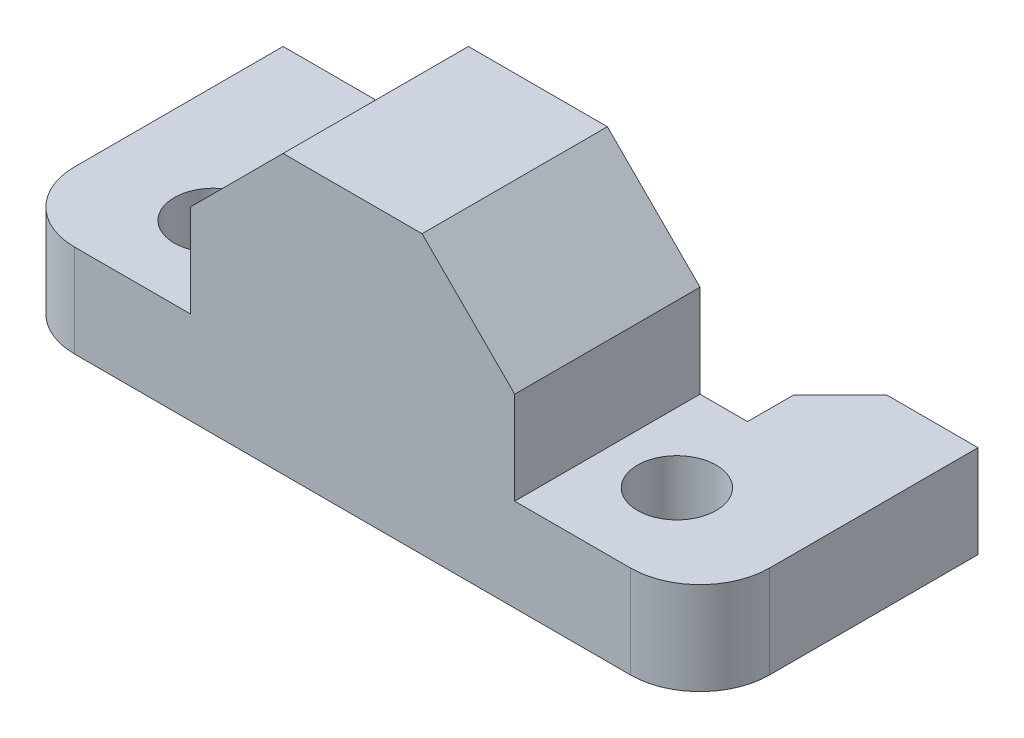
ISO-10303-21;
HEADER;
FILE_DESCRIPTION(('STEP AP214'),'2;1');
FILE_NAME('part.step','',(''),(''),'','','');
FILE_SCHEMA(('AUTOMOTIVE_DESIGN { 1 0 10303 214 1 1 1 1 }'));
ENDSEC;
DATA;
#1=APPLICATION_CONTEXT('core data for automotive mechanical design processes');
#2=APPLICATION_PROTOCOL_DEFINITION('international standard','automotive_design',2000,#1);
#3=PRODUCT_CONTEXT('',#1,'mechanical');
#4=PRODUCT('Part','Part','',(#3));
#5=PRODUCT_RELATED_PRODUCT_CATEGORY('part','',(#4));
#6=PRODUCT_DEFINITION_FORMATION('','',#4);
#7=PRODUCT_DEFINITION_CONTEXT('part definition',#1,'design');
#8=PRODUCT_DEFINITION('design','',#6,#7);
#9=PRODUCT_DEFINITION_SHAPE('','',#8);
#10=(LENGTH_UNIT() NAMED_UNIT(*) SI_UNIT(.MILLI.,.METRE.));
#11=(NAMED_UNIT(*) PLANE_ANGLE_UNIT() SI_UNIT($,.RADIAN.));
#12=(NAMED_UNIT(*) SI_UNIT($,.STERADIAN.) SOLID_ANGLE_UNIT());
#13=UNCERTAINTY_MEASURE_WITH_UNIT(LENGTH_MEASURE(1.E-05),#10,'distance_accuracy_value','');
#14=(GEOMETRIC_REPRESENTATION_CONTEXT(3) GLOBAL_UNCERTAINTY_ASSIGNED_CONTEXT((#13)) GLOBAL_UNIT_ASSIGNED_CONTEXT((#10,
#11,#12)) REPRESENTATION_CONTEXT('',''));
#15=CARTESIAN_POINT('',(0.,0.,0.));
#16=DIRECTION('',(0.,0.,1.));
#17=DIRECTION('',(1.,0.,0.));
#18=AXIS2_PLACEMENT_3D('',#15,#16,#17);
#19=CARTESIAN_POINT('',(0.,4.,0.));
#20=DIRECTION('',(0.,-1.,0.));
#21=DIRECTION('',(0.,0.,-1.));
#22=AXIS2_PLACEMENT_3D('',#19,#20,#21);
#23=PLANE('',#22);
#24=CARTESIAN_POINT('',(0.,4.,0.));
#25=DIRECTION('',(0.,1.,0.));
#26=DIRECTION('',(0.,0.,1.));
#27=AXIS2_PLACEMENT_3D('',#24,#25,#26);
#28=CIRCLE('',#27,1.7);
#29=CARTESIAN_POINT('',(0.,4.,1.7));
#30=VERTEX_POINT('',#29);
#31=EDGE_CURVE('E271',#30,#30,#28,.T.);
#32=ORIENTED_EDGE('',*,*,#31,.F.);
#33=EDGE_LOOP('',(#32));
#34=FACE_BOUND('',#33,.T.);
#35=DIRECTION('',(0.,0.,1.));
#36=VECTOR('',#35,1.);
#37=CARTESIAN_POINT('',(0.949999999999993,4.,0.));
#38=LINE('',#37,#36);
#39=CARTESIAN_POINT('',(0.949999999999993,4.,-6.00000000000001));
#40=VERTEX_POINT('',#39);
#41=CARTESIAN_POINT('',(0.949999999999993,4.,-4.));
#42=VERTEX_POINT('',#41);
#43=EDGE_CURVE('E239',#40,#42,#38,.T.);
#44=ORIENTED_EDGE('',*,*,#43,.F.);
#45=DIRECTION('',(0.707106781186549,0.,0.707106781186546));
#46=VECTOR('',#45,1.);
#47=CARTESIAN_POINT('',(0.949999999999993,4.,-6.00000000000001));
#48=LINE('',#47,#46);
#49=CARTESIAN_POINT('',(-1.05000000000001,4.,-8.));
#50=VERTEX_POINT('',#49);
#51=EDGE_CURVE('E59',#40,#50,#48,.F.);
#52=ORIENTED_EDGE('',*,*,#51,.T.);
#53=DIRECTION('',(1.,0.,0.));
#54=VECTOR('',#53,1.);
#55=CARTESIAN_POINT('',(0.,4.,-8.));
#56=LINE('',#55,#54);
#57=CARTESIAN_POINT('',(-5.,4.,-8.));
#58=VERTEX_POINT('',#57);
#59=EDGE_CURVE('E246',#58,#50,#56,.T.);
#60=ORIENTED_EDGE('',*,*,#59,.F.);
#61=DIRECTION('',(0.,0.,1.));
#62=VECTOR('',#61,1.);
#63=CARTESIAN_POINT('',(-5.,4.,4.));
#64=LINE('',#63,#62);
#65=CARTESIAN_POINT('',(-5.,4.,1.));
#66=VERTEX_POINT('',#65);
#67=EDGE_CURVE('E199',#58,#66,#64,.T.);
#68=ORIENTED_EDGE('',*,*,#67,.T.);
#69=CARTESIAN_POINT('',(-2.,4.,1.));
#70=DIRECTION('',(0.,-1.,0.));
#71=DIRECTION('',(0.,0.,-1.));
#72=AXIS2_PLACEMENT_3D('',#69,#70,#71);
#73=CIRCLE('',#72,3.);
#74=CARTESIAN_POINT('',(-2.,4.,4.));
#75=VERTEX_POINT('',#74);
#76=EDGE_CURVE('E322',#66,#75,#73,.F.);
#77=ORIENTED_EDGE('',*,*,#76,.T.);
#78=DIRECTION('',(1.,0.,0.));
#79=VECTOR('',#78,1.);
#80=CARTESIAN_POINT('',(-5.,4.,4.));
#81=LINE('',#80,#79);
#82=CARTESIAN_POINT('',(2.99999999999999,4.,4.));
#83=VERTEX_POINT('',#82);
#84=EDGE_CURVE('E287',#75,#83,#81,.T.);
#85=ORIENTED_EDGE('',*,*,#84,.T.);
#86=DIRECTION('',(0.,0.,1.));
#87=VECTOR('',#86,1.);
#88=CARTESIAN_POINT('',(2.99999999999999,4.,-4.));
#89=LINE('',#88,#87);
#90=CARTESIAN_POINT('',(2.99999999999999,4.,-4.));
#91=VERTEX_POINT('',#90);
#92=EDGE_CURVE('E205',#91,#83,#89,.T.);
#93=ORIENTED_EDGE('',*,*,#92,.F.);
#94=DIRECTION('',(-1.,0.,0.));
#95=VECTOR('',#94,1.);
#96=CARTESIAN_POINT('',(-5.,4.,-4.));
#97=LINE('',#96,#95);
#98=EDGE_CURVE('E200',#91,#42,#97,.T.);
#99=ORIENTED_EDGE('',*,*,#98,.T.);
#100=EDGE_LOOP('',(#44,#52,#60,#68,#77,#85,#93,#99));
#101=FACE_BOUND('',#100,.T.);
#102=ADVANCED_FACE('F49',(#34,#101),#23,.F.);
#103=CARTESIAN_POINT('',(20.,4.,0.));
#104=DIRECTION('',(0.,1.,0.));
#105=DIRECTION('',(0.,0.,1.));
#106=AXIS2_PLACEMENT_3D('',#103,#104,#105);
#107=CIRCLE('',#106,1.7);
#108=CARTESIAN_POINT('',(20.,4.,1.7));
#109=VERTEX_POINT('',#108);
#110=EDGE_CURVE('E263',#109,#109,#107,.T.);
#111=ORIENTED_EDGE('',*,*,#110,.F.);
#112=EDGE_LOOP('',(#111));
#113=FACE_BOUND('',#112,.T.);
#114=DIRECTION('',(-1.,0.,0.));
#115=VECTOR('',#114,1.);
#116=CARTESIAN_POINT('',(0.,4.,-8.00000000000001));
#117=LINE('',#116,#115);
#118=CARTESIAN_POINT('',(25.,4.,-8.));
#119=VERTEX_POINT('',#118);
#120=CARTESIAN_POINT('',(21.05,4.,-8.));
#121=VERTEX_POINT('',#120);
#122=EDGE_CURVE('E222',#119,#121,#117,.T.);
#123=ORIENTED_EDGE('',*,*,#122,.T.);
#124=DIRECTION('',(0.707106781186547,0.,-0.707106781186548));
#125=VECTOR('',#124,1.);
#126=CARTESIAN_POINT('',(21.05,4.,-8.));
#127=LINE('',#126,#125);
#128=CARTESIAN_POINT('',(19.05,4.,-6.));
#129=VERTEX_POINT('',#128);
#130=EDGE_CURVE('E360',#121,#129,#127,.F.);
#131=ORIENTED_EDGE('',*,*,#130,.T.);
#132=DIRECTION('',(0.,0.,1.));
#133=VECTOR('',#132,1.);
#134=CARTESIAN_POINT('',(19.05,4.,0.));
#135=LINE('',#134,#133);
#136=CARTESIAN_POINT('',(19.05,4.,-4.));
#137=VERTEX_POINT('',#136);
#138=EDGE_CURVE('E196',#129,#137,#135,.T.);
#139=ORIENTED_EDGE('',*,*,#138,.T.);
#140=CARTESIAN_POINT('',(17.,4.,-4.));
#141=VERTEX_POINT('',#140);
#142=EDGE_CURVE('E180',#137,#141,#97,.T.);
#143=ORIENTED_EDGE('',*,*,#142,.T.);
#144=DIRECTION('',(0.,0.,-1.));
#145=VECTOR('',#144,1.);
#146=CARTESIAN_POINT('',(17.,4.,-4.));
#147=LINE('',#146,#145);
#148=CARTESIAN_POINT('',(17.,4.,4.));
#149=VERTEX_POINT('',#148);
#150=EDGE_CURVE('E193',#149,#141,#147,.T.);
#151=ORIENTED_EDGE('',*,*,#150,.F.);
#152=CARTESIAN_POINT('',(22.,4.,4.));
#153=VERTEX_POINT('',#152);
#154=EDGE_CURVE('E286',#149,#153,#81,.T.);
#155=ORIENTED_EDGE('',*,*,#154,.T.);
#156=CARTESIAN_POINT('',(22.,4.,0.999999999999999));
#157=DIRECTION('',(0.,-1.,0.));
#158=DIRECTION('',(0.,0.,-1.));
#159=AXIS2_PLACEMENT_3D('',#156,#157,#158);
#160=CIRCLE('',#159,3.);
#161=CARTESIAN_POINT('',(25.,4.,0.999999999999999));
#162=VERTEX_POINT('',#161);
#163=EDGE_CURVE('E325',#153,#162,#160,.F.);
#164=ORIENTED_EDGE('',*,*,#163,.T.);
#165=DIRECTION('',(0.,0.,-1.));
#166=VECTOR('',#165,1.);
#167=CARTESIAN_POINT('',(25.,4.,4.));
#168=LINE('',#167,#166);
#169=EDGE_CURVE('E279',#162,#119,#168,.T.);
#170=ORIENTED_EDGE('',*,*,#169,.T.);
#171=EDGE_LOOP('',(#123,#131,#139,#143,#151,#155,#164,#170));
#172=FACE_BOUND('',#171,.T.);
#173=ADVANCED_FACE('F192',(#113,#172),#23,.F.);
#174=CARTESIAN_POINT('',(0.,0.,0.));
#175=DIRECTION('',(0.,-1.,0.));
#176=DIRECTION('',(0.,0.,-1.));
#177=AXIS2_PLACEMENT_3D('',#174,#175,#176);
#178=PLANE('',#177);
#179=CARTESIAN_POINT('',(0.,0.,0.));
#180=DIRECTION('',(0.,1.,0.));
#181=DIRECTION('',(0.,0.,1.));
#182=AXIS2_PLACEMENT_3D('',#179,#180,#181);
#183=CIRCLE('',#182,1.7);
#184=CARTESIAN_POINT('',(0.,0.,1.7));
#185=VERTEX_POINT('',#184);
#186=EDGE_CURVE('E267',#185,#185,#183,.T.);
#187=ORIENTED_EDGE('',*,*,#186,.T.);
#188=EDGE_LOOP('',(#187));
#189=FACE_BOUND('',#188,.T.);
#190=DIRECTION('',(0.,0.,1.));
#191=VECTOR('',#190,1.);
#192=CARTESIAN_POINT('',(19.05,0.,0.));
#193=LINE('',#192,#191);
#194=CARTESIAN_POINT('',(19.05,0.,-6.));
#195=VERTEX_POINT('',#194);
#196=CARTESIAN_POINT('',(19.05,0.,-4.));
#197=VERTEX_POINT('',#196);
#198=EDGE_CURVE('E227',#195,#197,#193,.T.);
#199=ORIENTED_EDGE('',*,*,#198,.F.);
#200=DIRECTION('',(-0.707106781186547,0.,0.707106781186548));
#201=VECTOR('',#200,1.);
#202=CARTESIAN_POINT('',(6.52500000000002,0.,6.525));
#203=LINE('',#202,#201);
#204=CARTESIAN_POINT('',(21.05,0.,-8.));
#205=VERTEX_POINT('',#204);
#206=EDGE_CURVE('E369',#195,#205,#203,.F.);
#207=ORIENTED_EDGE('',*,*,#206,.T.);
#208=DIRECTION('',(-1.,0.,0.));
#209=VECTOR('',#208,1.);
#210=CARTESIAN_POINT('',(0.,0.,-8.00000000000001));
#211=LINE('',#210,#209);
#212=CARTESIAN_POINT('',(25.,0.,-8.));
#213=VERTEX_POINT('',#212);
#214=EDGE_CURVE('E223',#213,#205,#211,.T.);
#215=ORIENTED_EDGE('',*,*,#214,.F.);
#216=DIRECTION('',(0.,0.,-1.));
#217=VECTOR('',#216,1.);
#218=CARTESIAN_POINT('',(25.,0.,4.));
#219=LINE('',#218,#217);
#220=CARTESIAN_POINT('',(25.,0.,0.999999999999999));
#221=VERTEX_POINT('',#220);
#222=EDGE_CURVE('E275',#221,#213,#219,.T.);
#223=ORIENTED_EDGE('',*,*,#222,.F.);
#224=CARTESIAN_POINT('',(22.,0.,0.999999999999999));
#225=DIRECTION('',(0.,-1.,0.));
#226=DIRECTION('',(0.,0.,-1.));
#227=AXIS2_PLACEMENT_3D('',#224,#225,#226);
#228=CIRCLE('',#227,3.);
#229=CARTESIAN_POINT('',(22.,0.,4.));
#230=VERTEX_POINT('',#229);
#231=EDGE_CURVE('E311',#221,#230,#228,.T.);
#232=ORIENTED_EDGE('',*,*,#231,.T.);
#233=DIRECTION('',(1.,0.,0.));
#234=VECTOR('',#233,1.);
#235=CARTESIAN_POINT('',(-5.,0.,4.));
#236=LINE('',#235,#234);
#237=CARTESIAN_POINT('',(-2.,0.,4.));
#238=VERTEX_POINT('',#237);
#239=EDGE_CURVE('E281',#238,#230,#236,.T.);
#240=ORIENTED_EDGE('',*,*,#239,.F.);
#241=CARTESIAN_POINT('',(-2.,0.,1.));
#242=DIRECTION('',(0.,-1.,0.));
#243=DIRECTION('',(0.,0.,-1.));
#244=AXIS2_PLACEMENT_3D('',#241,#242,#243);
#245=CIRCLE('',#244,3.);
#246=CARTESIAN_POINT('',(-5.,0.,1.));
#247=VERTEX_POINT('',#246);
#248=EDGE_CURVE('E308',#238,#247,#245,.T.);
#249=ORIENTED_EDGE('',*,*,#248,.T.);
#250=DIRECTION('',(0.,0.,1.));
#251=VECTOR('',#250,1.);
#252=CARTESIAN_POINT('',(-5.,0.,4.));
#253=LINE('',#252,#251);
#254=CARTESIAN_POINT('',(-5.,0.,-8.));
#255=VERTEX_POINT('',#254);
#256=EDGE_CURVE('E298',#255,#247,#253,.T.);
#257=ORIENTED_EDGE('',*,*,#256,.F.);
#258=DIRECTION('',(1.,0.,0.));
#259=VECTOR('',#258,1.);
#260=CARTESIAN_POINT('',(0.,0.,-8.));
#261=LINE('',#260,#259);
#262=CARTESIAN_POINT('',(-1.05000000000001,0.,-8.));
#263=VERTEX_POINT('',#262);
#264=EDGE_CURVE('E245',#255,#263,#261,.T.);
#265=ORIENTED_EDGE('',*,*,#264,.T.);
#266=DIRECTION('',(-0.707106781186549,0.,-0.707106781186546));
#267=VECTOR('',#266,1.);
#268=CARTESIAN_POINT('',(3.475,0.,-3.47500000000001));
#269=LINE('',#268,#267);
#270=CARTESIAN_POINT('',(0.949999999999993,0.,-6.00000000000001));
#271=VERTEX_POINT('',#270);
#272=EDGE_CURVE('E366',#263,#271,#269,.F.);
#273=ORIENTED_EDGE('',*,*,#272,.T.);
#274=DIRECTION('',(0.,0.,1.));
#275=VECTOR('',#274,1.);
#276=CARTESIAN_POINT('',(0.949999999999993,0.,0.));
#277=LINE('',#276,#275);
#278=CARTESIAN_POINT('',(0.949999999999993,0.,-4.));
#279=VERTEX_POINT('',#278);
#280=EDGE_CURVE('E242',#271,#279,#277,.T.);
#281=ORIENTED_EDGE('',*,*,#280,.T.);
#282=DIRECTION('',(-1.,0.,0.));
#283=VECTOR('',#282,1.);
#284=CARTESIAN_POINT('',(-5.,0.,-4.));
#285=LINE('',#284,#283);
#286=EDGE_CURVE('E294',#197,#279,#285,.T.);
#287=ORIENTED_EDGE('',*,*,#286,.F.);
#288=EDGE_LOOP('',(#199,#207,#215,#223,#232,#240,#249,#257,#265,#273,#281,#287));
#289=FACE_BOUND('',#288,.T.);
#290=CARTESIAN_POINT('',(20.,0.,0.));
#291=DIRECTION('',(0.,1.,0.));
#292=DIRECTION('',(0.,0.,1.));
#293=AXIS2_PLACEMENT_3D('',#290,#291,#292);
#294=CIRCLE('',#293,1.7);
#295=CARTESIAN_POINT('',(20.,0.,1.7));
#296=VERTEX_POINT('',#295);
#297=EDGE_CURVE('E259',#296,#296,#294,.T.);
#298=ORIENTED_EDGE('',*,*,#297,.T.);
#299=EDGE_LOOP('',(#298));
#300=FACE_BOUND('',#299,.T.);
#301=ADVANCED_FACE('F406',(#189,#289,#300),#178,.T.);
#302=CARTESIAN_POINT('',(25.,4.,4.));
#303=DIRECTION('',(-1.,0.,0.));
#304=DIRECTION('',(0.,0.,1.));
#305=AXIS2_PLACEMENT_3D('',#302,#303,#304);
#306=PLANE('',#305);
#307=ORIENTED_EDGE('',*,*,#169,.F.);
#308=DIRECTION('',(0.,-1.,0.));
#309=VECTOR('',#308,1.);
#310=CARTESIAN_POINT('',(25.,4.,0.999999999999999));
#311=LINE('',#310,#309);
#312=EDGE_CURVE('E291',#162,#221,#311,.T.);
#313=ORIENTED_EDGE('',*,*,#312,.T.);
#314=ORIENTED_EDGE('',*,*,#222,.T.);
#315=DIRECTION('',(0.,1.,0.));
#316=VECTOR('',#315,1.);
#317=CARTESIAN_POINT('',(25.,0.,-8.));
#318=LINE('',#317,#316);
#319=EDGE_CURVE('E235',#213,#119,#318,.T.);
#320=ORIENTED_EDGE('',*,*,#319,.T.);
#321=EDGE_LOOP('',(#307,#313,#314,#320));
#322=FACE_BOUND('',#321,.T.);
#323=ADVANCED_FACE('F398',(#322),#306,.F.);
#324=CARTESIAN_POINT('',(-5.,4.,-4.));
#325=DIRECTION('',(0.,0.,1.));
#326=DIRECTION('',(1.,0.,0.));
#327=AXIS2_PLACEMENT_3D('',#324,#325,#326);
#328=PLANE('',#327);
#329=DIRECTION('',(-1.,0.,0.));
#330=VECTOR('',#329,1.);
#331=CARTESIAN_POINT('',(17.,12.,-4.));
#332=LINE('',#331,#330);
#333=CARTESIAN_POINT('',(13.,12.,-4.));
#334=VERTEX_POINT('',#333);
#335=CARTESIAN_POINT('',(6.99999999999999,12.,-4.));
#336=VERTEX_POINT('',#335);
#337=EDGE_CURVE('E212',#334,#336,#332,.T.);
#338=ORIENTED_EDGE('',*,*,#337,.F.);
#339=DIRECTION('',(-0.707106781186546,0.707106781186549,0.));
#340=VECTOR('',#339,1.);
#341=CARTESIAN_POINT('',(13.,12.,-4.));
#342=LINE('',#341,#340);
#343=CARTESIAN_POINT('',(17.,7.99999999999999,-4.));
#344=VERTEX_POINT('',#343);
#345=EDGE_CURVE('E181',#334,#344,#342,.F.);
#346=ORIENTED_EDGE('',*,*,#345,.T.);
#347=DIRECTION('',(0.,-1.,0.));
#348=VECTOR('',#347,1.);
#349=CARTESIAN_POINT('',(17.,12.,-4.));
#350=LINE('',#349,#348);
#351=EDGE_CURVE('E175',#344,#141,#350,.T.);
#352=ORIENTED_EDGE('',*,*,#351,.T.);
#353=ORIENTED_EDGE('',*,*,#142,.F.);
#354=DIRECTION('',(0.,1.,0.));
#355=VECTOR('',#354,1.);
#356=CARTESIAN_POINT('',(19.05,0.,-4.));
#357=LINE('',#356,#355);
#358=EDGE_CURVE('E230',#197,#137,#357,.T.);
#359=ORIENTED_EDGE('',*,*,#358,.F.);
#360=ORIENTED_EDGE('',*,*,#286,.T.);
#361=DIRECTION('',(0.,1.,0.));
#362=VECTOR('',#361,1.);
#363=CARTESIAN_POINT('',(0.949999999999993,0.,-4.));
#364=LINE('',#363,#362);
#365=EDGE_CURVE('E250',#279,#42,#364,.T.);
#366=ORIENTED_EDGE('',*,*,#365,.T.);
#367=ORIENTED_EDGE('',*,*,#98,.F.);
#368=DIRECTION('',(0.,-1.,0.));
#369=VECTOR('',#368,1.);
#370=CARTESIAN_POINT('',(2.99999999999999,12.,-4.));
#371=LINE('',#370,#369);
#372=CARTESIAN_POINT('',(2.99999999999999,7.99999999999999,-4.));
#373=VERTEX_POINT('',#372);
#374=EDGE_CURVE('E187',#373,#91,#371,.T.);
#375=ORIENTED_EDGE('',*,*,#374,.F.);
#376=DIRECTION('',(-0.707106781186546,-0.707106781186549,0.));
#377=VECTOR('',#376,1.);
#378=CARTESIAN_POINT('',(6.99999999999999,12.,-4.));
#379=LINE('',#378,#377);
#380=EDGE_CURVE('E339',#373,#336,#379,.F.);
#381=ORIENTED_EDGE('',*,*,#380,.T.);
#382=EDGE_LOOP('',(#338,#346,#352,#353,#359,#360,#366,#367,#375,#381));
#383=FACE_BOUND('',#382,.T.);
#384=ADVANCED_FACE('F178',(#383),#328,.F.);
#385=CARTESIAN_POINT('',(-5.,4.,4.));
#386=DIRECTION('',(1.,0.,0.));
#387=DIRECTION('',(0.,0.,-1.));
#388=AXIS2_PLACEMENT_3D('',#385,#386,#387);
#389=PLANE('',#388);
#390=ORIENTED_EDGE('',*,*,#256,.T.);
#391=DIRECTION('',(0.,-1.,0.));
#392=VECTOR('',#391,1.);
#393=CARTESIAN_POINT('',(-5.,4.,1.));
#394=LINE('',#393,#392);
#395=EDGE_CURVE('E328',#247,#66,#394,.F.);
#396=ORIENTED_EDGE('',*,*,#395,.T.);
#397=ORIENTED_EDGE('',*,*,#67,.F.);
#398=DIRECTION('',(0.,1.,0.));
#399=VECTOR('',#398,1.);
#400=CARTESIAN_POINT('',(-5.,0.,-8.));
#401=LINE('',#400,#399);
#402=EDGE_CURVE('E255',#255,#58,#401,.T.);
#403=ORIENTED_EDGE('',*,*,#402,.F.);
#404=EDGE_LOOP('',(#390,#396,#397,#403));
#405=FACE_BOUND('',#404,.T.);
#406=ADVANCED_FACE('F418',(#405),#389,.F.);
#407=CARTESIAN_POINT('',(-5.,4.,4.));
#408=DIRECTION('',(0.,0.,-1.));
#409=DIRECTION('',(-1.,0.,0.));
#410=AXIS2_PLACEMENT_3D('',#407,#408,#409);
#411=PLANE('',#410);
#412=DIRECTION('',(0.,-1.,0.));
#413=VECTOR('',#412,1.);
#414=CARTESIAN_POINT('',(17.,12.,4.));
#415=LINE('',#414,#413);
#416=CARTESIAN_POINT('',(17.,7.99999999999999,4.));
#417=VERTEX_POINT('',#416);
#418=EDGE_CURVE('E186',#417,#149,#415,.T.);
#419=ORIENTED_EDGE('',*,*,#418,.F.);
#420=DIRECTION('',(0.707106781186546,-0.707106781186549,0.));
#421=VECTOR('',#420,1.);
#422=CARTESIAN_POINT('',(13.,12.,4.));
#423=LINE('',#422,#421);
#424=CARTESIAN_POINT('',(13.,12.,4.));
#425=VERTEX_POINT('',#424);
#426=EDGE_CURVE('E350',#417,#425,#423,.F.);
#427=ORIENTED_EDGE('',*,*,#426,.T.);
#428=DIRECTION('',(1.,0.,0.));
#429=VECTOR('',#428,1.);
#430=CARTESIAN_POINT('',(2.99999999999999,12.,4.));
#431=LINE('',#430,#429);
#432=CARTESIAN_POINT('',(6.99999999999999,12.,4.));
#433=VERTEX_POINT('',#432);
#434=EDGE_CURVE('E209',#433,#425,#431,.T.);
#435=ORIENTED_EDGE('',*,*,#434,.F.);
#436=DIRECTION('',(0.707106781186546,0.707106781186549,0.));
#437=VECTOR('',#436,1.);
#438=CARTESIAN_POINT('',(6.99999999999999,12.,4.));
#439=LINE('',#438,#437);
#440=CARTESIAN_POINT('',(2.99999999999999,7.99999999999999,4.));
#441=VERTEX_POINT('',#440);
#442=EDGE_CURVE('E347',#433,#441,#439,.F.);
#443=ORIENTED_EDGE('',*,*,#442,.T.);
#444=DIRECTION('',(0.,-1.,0.));
#445=VECTOR('',#444,1.);
#446=CARTESIAN_POINT('',(2.99999999999999,12.,4.));
#447=LINE('',#446,#445);
#448=EDGE_CURVE('E215',#441,#83,#447,.T.);
#449=ORIENTED_EDGE('',*,*,#448,.T.);
#450=ORIENTED_EDGE('',*,*,#84,.F.);
#451=DIRECTION('',(0.,-1.,0.));
#452=VECTOR('',#451,1.);
#453=CARTESIAN_POINT('',(-2.,4.,4.));
#454=LINE('',#453,#452);
#455=EDGE_CURVE('E314',#75,#238,#454,.T.);
#456=ORIENTED_EDGE('',*,*,#455,.T.);
#457=ORIENTED_EDGE('',*,*,#239,.T.);
#458=DIRECTION('',(0.,-1.,0.));
#459=VECTOR('',#458,1.);
#460=CARTESIAN_POINT('',(22.,4.,4.));
#461=LINE('',#460,#459);
#462=EDGE_CURVE('E318',#230,#153,#461,.F.);
#463=ORIENTED_EDGE('',*,*,#462,.T.);
#464=ORIENTED_EDGE('',*,*,#154,.F.);
#465=EDGE_LOOP('',(#419,#427,#435,#443,#449,#450,#456,#457,#463,#464));
#466=FACE_BOUND('',#465,.T.);
#467=ADVANCED_FACE('F391',(#466),#411,.F.);
#468=CARTESIAN_POINT('',(0.,4.,0.));
#469=DIRECTION('',(0.,-1.,0.));
#470=DIRECTION('',(0.,0.,-1.));
#471=AXIS2_PLACEMENT_3D('',#468,#469,#470);
#472=CYLINDRICAL_SURFACE('',#471,1.7);
#473=ORIENTED_EDGE('',*,*,#31,.T.);
#474=EDGE_LOOP('',(#473));
#475=FACE_BOUND('',#474,.T.);
#476=ORIENTED_EDGE('',*,*,#186,.F.);
#477=EDGE_LOOP('',(#476));
#478=FACE_BOUND('',#477,.T.);
#479=ADVANCED_FACE('F458',(#475,#478),#472,.F.);
#480=CARTESIAN_POINT('',(20.,4.,0.));
#481=DIRECTION('',(0.,-1.,0.));
#482=DIRECTION('',(0.,0.,-1.));
#483=AXIS2_PLACEMENT_3D('',#480,#481,#482);
#484=CYLINDRICAL_SURFACE('',#483,1.7);
#485=ORIENTED_EDGE('',*,*,#110,.T.);
#486=EDGE_LOOP('',(#485));
#487=FACE_BOUND('',#486,.T.);
#488=ORIENTED_EDGE('',*,*,#297,.F.);
#489=EDGE_LOOP('',(#488));
#490=FACE_BOUND('',#489,.T.);
#491=ADVANCED_FACE('F473',(#487,#490),#484,.F.);
#492=CARTESIAN_POINT('',(22.,4.,0.999999999999999));
#493=DIRECTION('',(0.,-1.,0.));
#494=DIRECTION('',(0.,0.,-1.));
#495=AXIS2_PLACEMENT_3D('',#492,#493,#494);
#496=CYLINDRICAL_SURFACE('',#495,3.);
#497=ORIENTED_EDGE('',*,*,#163,.F.);
#498=ORIENTED_EDGE('',*,*,#462,.F.);
#499=ORIENTED_EDGE('',*,*,#231,.F.);
#500=ORIENTED_EDGE('',*,*,#312,.F.);
#501=EDGE_LOOP('',(#497,#498,#499,#500));
#502=FACE_BOUND('',#501,.T.);
#503=ADVANCED_FACE('F402',(#502),#496,.T.);
#504=CARTESIAN_POINT('',(-2.,4.,1.));
#505=DIRECTION('',(0.,-1.,0.));
#506=DIRECTION('',(0.,0.,-1.));
#507=AXIS2_PLACEMENT_3D('',#504,#505,#506);
#508=CYLINDRICAL_SURFACE('',#507,3.);
#509=ORIENTED_EDGE('',*,*,#76,.F.);
#510=ORIENTED_EDGE('',*,*,#395,.F.);
#511=ORIENTED_EDGE('',*,*,#248,.F.);
#512=ORIENTED_EDGE('',*,*,#455,.F.);
#513=EDGE_LOOP('',(#509,#510,#511,#512));
#514=FACE_BOUND('',#513,.T.);
#515=ADVANCED_FACE('F413',(#514),#508,.T.);
#516=CARTESIAN_POINT('',(0.,0.,-8.));
#517=DIRECTION('',(0.,0.,1.));
#518=DIRECTION('',(1.,0.,0.));
#519=AXIS2_PLACEMENT_3D('',#516,#517,#518);
#520=PLANE('',#519);
#521=ORIENTED_EDGE('',*,*,#59,.T.);
#522=DIRECTION('',(0.,-1.,0.));
#523=VECTOR('',#522,1.);
#524=CARTESIAN_POINT('',(-1.05000000000001,0.,-8.));
#525=LINE('',#524,#523);
#526=EDGE_CURVE('E11',#50,#263,#525,.T.);
#527=ORIENTED_EDGE('',*,*,#526,.T.);
#528=ORIENTED_EDGE('',*,*,#264,.F.);
#529=ORIENTED_EDGE('',*,*,#402,.T.);
#530=EDGE_LOOP('',(#521,#527,#528,#529));
#531=FACE_BOUND('',#530,.T.);
#532=ADVANCED_FACE('F420',(#531),#520,.F.);
#533=CARTESIAN_POINT('',(0.949999999999993,0.,0.));
#534=DIRECTION('',(-1.,0.,0.));
#535=DIRECTION('',(0.,0.,1.));
#536=AXIS2_PLACEMENT_3D('',#533,#534,#535);
#537=PLANE('',#536);
#538=ORIENTED_EDGE('',*,*,#280,.F.);
#539=DIRECTION('',(0.,1.,0.));
#540=VECTOR('',#539,1.);
#541=CARTESIAN_POINT('',(0.949999999999993,0.,-6.00000000000001));
#542=LINE('',#541,#540);
#543=EDGE_CURVE('E372',#271,#40,#542,.T.);
#544=ORIENTED_EDGE('',*,*,#543,.T.);
#545=ORIENTED_EDGE('',*,*,#43,.T.);
#546=ORIENTED_EDGE('',*,*,#365,.F.);
#547=EDGE_LOOP('',(#538,#544,#545,#546));
#548=FACE_BOUND('',#547,.T.);
#549=ADVANCED_FACE('F424',(#548),#537,.F.);
#550=CARTESIAN_POINT('',(0.,0.,-8.00000000000001));
#551=DIRECTION('',(0.,0.,-1.));
#552=DIRECTION('',(-1.,0.,0.));
#553=AXIS2_PLACEMENT_3D('',#550,#551,#552);
#554=PLANE('',#553);
#555=ORIENTED_EDGE('',*,*,#214,.T.);
#556=DIRECTION('',(0.,1.,0.));
#557=VECTOR('',#556,1.);
#558=CARTESIAN_POINT('',(21.05,0.,-8.));
#559=LINE('',#558,#557);
#560=EDGE_CURVE('E356',#205,#121,#559,.T.);
#561=ORIENTED_EDGE('',*,*,#560,.T.);
#562=ORIENTED_EDGE('',*,*,#122,.F.);
#563=ORIENTED_EDGE('',*,*,#319,.F.);
#564=EDGE_LOOP('',(#555,#561,#562,#563));
#565=FACE_BOUND('',#564,.T.);
#566=ADVANCED_FACE('F437',(#565),#554,.T.);
#567=CARTESIAN_POINT('',(19.05,0.,0.));
#568=DIRECTION('',(-1.,0.,0.));
#569=DIRECTION('',(0.,0.,1.));
#570=AXIS2_PLACEMENT_3D('',#567,#568,#569);
#571=PLANE('',#570);
#572=ORIENTED_EDGE('',*,*,#138,.F.);
#573=DIRECTION('',(0.,-1.,0.));
#574=VECTOR('',#573,1.);
#575=CARTESIAN_POINT('',(19.05,0.,-6.));
#576=LINE('',#575,#574);
#577=EDGE_CURVE('E363',#129,#195,#576,.T.);
#578=ORIENTED_EDGE('',*,*,#577,.T.);
#579=ORIENTED_EDGE('',*,*,#198,.T.);
#580=ORIENTED_EDGE('',*,*,#358,.T.);
#581=EDGE_LOOP('',(#572,#578,#579,#580));
#582=FACE_BOUND('',#581,.T.);
#583=ADVANCED_FACE('F438',(#582),#571,.T.);
#584=CARTESIAN_POINT('',(17.,12.,-4.));
#585=DIRECTION('',(-1.,0.,0.));
#586=DIRECTION('',(0.,0.,1.));
#587=AXIS2_PLACEMENT_3D('',#584,#585,#586);
#588=PLANE('',#587);
#589=ORIENTED_EDGE('',*,*,#351,.F.);
#590=DIRECTION('',(0.,0.,1.));
#591=VECTOR('',#590,1.);
#592=CARTESIAN_POINT('',(17.,7.99999999999999,-4.));
#593=LINE('',#592,#591);
#594=EDGE_CURVE('E344',#344,#417,#593,.T.);
#595=ORIENTED_EDGE('',*,*,#594,.T.);
#596=ORIENTED_EDGE('',*,*,#418,.T.);
#597=ORIENTED_EDGE('',*,*,#150,.T.);
#598=EDGE_LOOP('',(#589,#595,#596,#597));
#599=FACE_BOUND('',#598,.T.);
#600=ADVANCED_FACE('F202',(#599),#588,.F.);
#601=CARTESIAN_POINT('',(2.99999999999999,12.,-4.));
#602=DIRECTION('',(1.,0.,0.));
#603=DIRECTION('',(0.,0.,-1.));
#604=AXIS2_PLACEMENT_3D('',#601,#602,#603);
#605=PLANE('',#604);
#606=ORIENTED_EDGE('',*,*,#448,.F.);
#607=DIRECTION('',(0.,0.,-1.));
#608=VECTOR('',#607,1.);
#609=CARTESIAN_POINT('',(2.99999999999999,7.99999999999999,-4.));
#610=LINE('',#609,#608);
#611=EDGE_CURVE('E353',#441,#373,#610,.T.);
#612=ORIENTED_EDGE('',*,*,#611,.T.);
#613=ORIENTED_EDGE('',*,*,#374,.T.);
#614=ORIENTED_EDGE('',*,*,#92,.T.);
#615=EDGE_LOOP('',(#606,#612,#613,#614));
#616=FACE_BOUND('',#615,.T.);
#617=ADVANCED_FACE('F445',(#616),#605,.F.);
#618=CARTESIAN_POINT('',(0.,12.,0.));
#619=DIRECTION('',(0.,-1.,0.));
#620=DIRECTION('',(0.,0.,-1.));
#621=AXIS2_PLACEMENT_3D('',#618,#619,#620);
#622=PLANE('',#621);
#623=ORIENTED_EDGE('',*,*,#434,.T.);
#624=DIRECTION('',(0.,0.,-1.));
#625=VECTOR('',#624,1.);
#626=CARTESIAN_POINT('',(13.,12.,0.));
#627=LINE('',#626,#625);
#628=EDGE_CURVE('E335',#425,#334,#627,.T.);
#629=ORIENTED_EDGE('',*,*,#628,.T.);
#630=ORIENTED_EDGE('',*,*,#337,.T.);
#631=DIRECTION('',(0.,0.,1.));
#632=VECTOR('',#631,1.);
#633=CARTESIAN_POINT('',(6.99999999999999,12.,0.));
#634=LINE('',#633,#632);
#635=EDGE_CURVE('E331',#336,#433,#634,.T.);
#636=ORIENTED_EDGE('',*,*,#635,.T.);
#637=EDGE_LOOP('',(#623,#629,#630,#636));
#638=FACE_BOUND('',#637,.T.);
#639=ADVANCED_FACE('F385',(#638),#622,.F.);
#640=CARTESIAN_POINT('',(13.,12.,0.));
#641=DIRECTION('',(-0.707106781186549,-0.707106781186546,0.));
#642=DIRECTION('',(0.,0.,-1.));
#643=AXIS2_PLACEMENT_3D('',#640,#641,#642);
#644=PLANE('',#643);
#645=ORIENTED_EDGE('',*,*,#426,.F.);
#646=ORIENTED_EDGE('',*,*,#594,.F.);
#647=ORIENTED_EDGE('',*,*,#345,.F.);
#648=ORIENTED_EDGE('',*,*,#628,.F.);
#649=EDGE_LOOP('',(#645,#646,#647,#648));
#650=FACE_BOUND('',#649,.T.);
#651=ADVANCED_FACE('F390',(#650),#644,.F.);
#652=CARTESIAN_POINT('',(6.99999999999999,12.,0.));
#653=DIRECTION('',(0.707106781186549,-0.707106781186546,0.));
#654=DIRECTION('',(0.,0.,1.));
#655=AXIS2_PLACEMENT_3D('',#652,#653,#654);
#656=PLANE('',#655);
#657=ORIENTED_EDGE('',*,*,#380,.F.);
#658=ORIENTED_EDGE('',*,*,#611,.F.);
#659=ORIENTED_EDGE('',*,*,#442,.F.);
#660=ORIENTED_EDGE('',*,*,#635,.F.);
#661=EDGE_LOOP('',(#657,#658,#659,#660));
#662=FACE_BOUND('',#661,.T.);
#663=ADVANCED_FACE('F482',(#662),#656,.F.);
#664=CARTESIAN_POINT('',(21.05,0.,-8.));
#665=DIRECTION('',(0.707106781186548,0.,0.707106781186547));
#666=DIRECTION('',(0.,1.,0.));
#667=AXIS2_PLACEMENT_3D('',#664,#665,#666);
#668=PLANE('',#667);
#669=ORIENTED_EDGE('',*,*,#206,.F.);
#670=ORIENTED_EDGE('',*,*,#577,.F.);
#671=ORIENTED_EDGE('',*,*,#130,.F.);
#672=ORIENTED_EDGE('',*,*,#560,.F.);
#673=EDGE_LOOP('',(#669,#670,#671,#672));
#674=FACE_BOUND('',#673,.T.);
#675=ADVANCED_FACE('F435',(#674),#668,.F.);
#676=CARTESIAN_POINT('',(0.949999999999993,0.,-6.00000000000001));
#677=DIRECTION('',(-0.707106781186546,0.,0.707106781186549));
#678=DIRECTION('',(0.,1.,0.));
#679=AXIS2_PLACEMENT_3D('',#676,#677,#678);
#680=PLANE('',#679);
#681=ORIENTED_EDGE('',*,*,#272,.F.);
#682=ORIENTED_EDGE('',*,*,#526,.F.);
#683=ORIENTED_EDGE('',*,*,#51,.F.);
#684=ORIENTED_EDGE('',*,*,#543,.F.);
#685=EDGE_LOOP('',(#681,#682,#683,#684));
#686=FACE_BOUND('',#685,.T.);
#687=ADVANCED_FACE('F52',(#686),#680,.F.);
#688=CLOSED_SHELL('',(#102,#173,#301,#323,#384,#406,#467,#479,#491,#503,#515,#532,#549,#566,
#583,#600,#617,#639,#651,#663,#675,#687));
#689=MANIFOLD_SOLID_BREP('B2',#688);
#690=ADVANCED_BREP_SHAPE_REPRESENTATION('',(#18,#689),#14);
#691=SHAPE_DEFINITION_REPRESENTATION(#9,#690);
ENDSEC;
END-ISO-10303-21;
